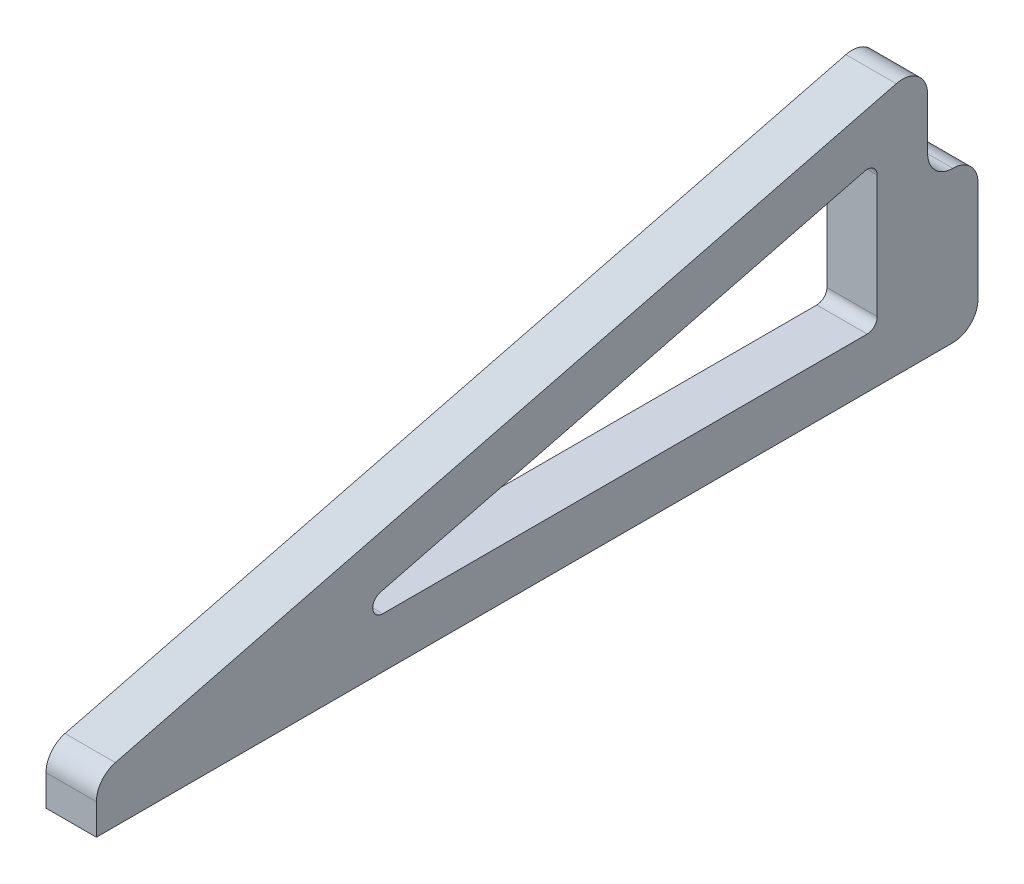
ISO-10303-21;
HEADER;
FILE_DESCRIPTION(('STEP AP214'),'2;1');
FILE_NAME('part.step','',(''),(''),'','','');
FILE_SCHEMA(('AUTOMOTIVE_DESIGN { 1 0 10303 214 1 1 1 1 }'));
ENDSEC;
DATA;
#1=APPLICATION_CONTEXT('core data for automotive mechanical design processes');
#2=APPLICATION_PROTOCOL_DEFINITION('international standard','automotive_design',2000,#1);
#3=PRODUCT_CONTEXT('',#1,'mechanical');
#4=PRODUCT('Part','Part','',(#3));
#5=PRODUCT_RELATED_PRODUCT_CATEGORY('part','',(#4));
#6=PRODUCT_DEFINITION_FORMATION('','',#4);
#7=PRODUCT_DEFINITION_CONTEXT('part definition',#1,'design');
#8=PRODUCT_DEFINITION('design','',#6,#7);
#9=PRODUCT_DEFINITION_SHAPE('','',#8);
#10=(LENGTH_UNIT() NAMED_UNIT(*) SI_UNIT(.MILLI.,.METRE.));
#11=(NAMED_UNIT(*) PLANE_ANGLE_UNIT() SI_UNIT($,.RADIAN.));
#12=(NAMED_UNIT(*) SI_UNIT($,.STERADIAN.) SOLID_ANGLE_UNIT());
#13=UNCERTAINTY_MEASURE_WITH_UNIT(LENGTH_MEASURE(1.E-05),#10,'distance_accuracy_value','');
#14=(GEOMETRIC_REPRESENTATION_CONTEXT(3) GLOBAL_UNCERTAINTY_ASSIGNED_CONTEXT((#13)) GLOBAL_UNIT_ASSIGNED_CONTEXT((#10,
#11,#12)) REPRESENTATION_CONTEXT('',''));
#15=CARTESIAN_POINT('',(0.,0.,0.));
#16=DIRECTION('',(0.,0.,1.));
#17=DIRECTION('',(1.,0.,0.));
#18=AXIS2_PLACEMENT_3D('',#15,#16,#17);
#19=CARTESIAN_POINT('',(12.7,-156.793460948185,-10.8700336615597));
#20=DIRECTION('',(1.,0.,0.));
#21=DIRECTION('',(0.,0.,-1.));
#22=AXIS2_PLACEMENT_3D('',#19,#20,#21);
#23=PLANE('',#22);
#24=DIRECTION('',(0.,0.,-1.));
#25=VECTOR('',#24,1.);
#26=CARTESIAN_POINT('',(12.7,-58.2070633333334,176.79917862854));
#27=LINE('',#26,#25);
#28=CARTESIAN_POINT('',(12.7,-58.2070633333334,156.395040848194));
#29=VERTEX_POINT('',#28);
#30=CARTESIAN_POINT('',(12.7,-58.2070633333334,34.29));
#31=VERTEX_POINT('',#30);
#32=EDGE_CURVE('E40',#29,#31,#27,.T.);
#33=ORIENTED_EDGE('',*,*,#32,.T.);
#34=CARTESIAN_POINT('',(12.7,-55.6670633333334,34.29));
#35=DIRECTION('',(1.,0.,0.));
#36=DIRECTION('',(0.,0.,-1.));
#37=AXIS2_PLACEMENT_3D('',#34,#35,#36);
#38=CIRCLE('',#37,2.54);
#39=CARTESIAN_POINT('',(12.7,-55.6670633333334,31.75));
#40=VERTEX_POINT('',#39);
#41=EDGE_CURVE('E247',#40,#31,#38,.F.);
#42=ORIENTED_EDGE('',*,*,#41,.F.);
#43=DIRECTION('',(0.,1.,0.));
#44=VECTOR('',#43,1.);
#45=CARTESIAN_POINT('',(12.7,-21.5258720205113,31.75));
#46=LINE('',#45,#44);
#47=CARTESIAN_POINT('',(12.7,-24.7881682857246,31.75));
#48=VERTEX_POINT('',#47);
#49=EDGE_CURVE('E252',#40,#48,#46,.T.);
#50=ORIENTED_EDGE('',*,*,#49,.T.);
#51=CARTESIAN_POINT('',(12.7,-24.7881682857246,34.29));
#52=DIRECTION('',(1.,0.,0.));
#53=DIRECTION('',(0.,0.,-1.));
#54=AXIS2_PLACEMENT_3D('',#51,#52,#53);
#55=CIRCLE('',#54,2.54);
#56=CARTESIAN_POINT('',(12.7,-22.3256887313528,34.912731438343));
#57=VERTEX_POINT('',#56);
#58=EDGE_CURVE('E241',#57,#48,#55,.F.);
#59=ORIENTED_EDGE('',*,*,#58,.F.);
#60=DIRECTION('',(0.,-0.245169857615365,0.969480139516464));
#61=VECTOR('',#60,1.);
#62=CARTESIAN_POINT('',(12.7,-50.792110364231,147.478079742594));
#63=LINE('',#62,#61);
#64=CARTESIAN_POINT('',(12.7,-53.2045837789615,157.017772286537));
#65=VERTEX_POINT('',#64);
#66=EDGE_CURVE('E249',#57,#65,#63,.T.);
#67=ORIENTED_EDGE('',*,*,#66,.T.);
#68=CARTESIAN_POINT('',(12.7,-55.6670633333334,156.395040848194));
#69=DIRECTION('',(1.,0.,0.));
#70=DIRECTION('',(0.,0.,-1.));
#71=AXIS2_PLACEMENT_3D('',#68,#69,#70);
#72=CIRCLE('',#71,2.54);
#73=EDGE_CURVE('E254',#29,#65,#72,.F.);
#74=ORIENTED_EDGE('',*,*,#73,.F.);
#75=EDGE_LOOP('',(#33,#42,#50,#59,#67,#74));
#76=FACE_BOUND('',#75,.T.);
#77=DIRECTION('',(0.,-0.245169857615367,0.969480139516463));
#78=VECTOR('',#77,1.);
#79=CARTESIAN_POINT('',(12.7,-0.373019534676384,-0.094332150269703));
#80=LINE('',#79,#78);
#81=CARTESIAN_POINT('',(12.7,-7.21393247154818,26.9568285958576));
#82=VERTEX_POINT('',#81);
#83=CARTESIAN_POINT('',(12.7,-56.9949279808075,223.806828595858));
#84=VERTEX_POINT('',#83);
#85=EDGE_CURVE('E283',#82,#84,#80,.T.);
#86=ORIENTED_EDGE('',*,*,#85,.F.);
#87=CARTESIAN_POINT('',(12.7,-13.3701313574777,25.4));
#88=DIRECTION('',(-1.,0.,0.));
#89=DIRECTION('',(0.,0.,1.));
#90=AXIS2_PLACEMENT_3D('',#87,#88,#89);
#91=CIRCLE('',#90,6.35);
#92=CARTESIAN_POINT('',(12.7,-13.3701313574777,19.05));
#93=VERTEX_POINT('',#92);
#94=EDGE_CURVE('E45',#82,#93,#91,.T.);
#95=ORIENTED_EDGE('',*,*,#94,.T.);
#96=DIRECTION('',(0.,-1.,0.));
#97=VECTOR('',#96,1.);
#98=CARTESIAN_POINT('',(12.7,0.,19.05));
#99=LINE('',#98,#97);
#100=CARTESIAN_POINT('',(12.7,-26.4570633333333,19.05));
#101=VERTEX_POINT('',#100);
#102=EDGE_CURVE('E11',#93,#101,#99,.T.);
#103=ORIENTED_EDGE('',*,*,#102,.T.);
#104=CARTESIAN_POINT('',(12.7,-26.4570633333333,12.7));
#105=DIRECTION('',(-1.,0.,0.));
#106=DIRECTION('',(0.,0.,1.));
#107=AXIS2_PLACEMENT_3D('',#104,#105,#106);
#108=CIRCLE('',#107,6.35);
#109=CARTESIAN_POINT('',(12.7,-32.8070633333333,12.7));
#110=VERTEX_POINT('',#109);
#111=EDGE_CURVE('E205',#101,#110,#108,.F.);
#112=ORIENTED_EDGE('',*,*,#111,.T.);
#113=CARTESIAN_POINT('',(12.7,-39.1570633333333,12.7));
#114=DIRECTION('',(-1.,0.,0.));
#115=DIRECTION('',(0.,0.,1.));
#116=AXIS2_PLACEMENT_3D('',#113,#114,#115);
#117=CIRCLE('',#116,6.35);
#118=CARTESIAN_POINT('',(12.7,-39.1570633333333,6.35000000000001));
#119=VERTEX_POINT('',#118);
#120=EDGE_CURVE('E236',#110,#119,#117,.T.);
#121=ORIENTED_EDGE('',*,*,#120,.T.);
#122=DIRECTION('',(0.,1.,0.));
#123=VECTOR('',#122,1.);
#124=CARTESIAN_POINT('',(12.7,-70.9070633333333,6.35000000000001));
#125=LINE('',#124,#123);
#126=CARTESIAN_POINT('',(12.7,-64.5570633333333,6.35000000000001));
#127=VERTEX_POINT('',#126);
#128=EDGE_CURVE('E245',#127,#119,#125,.T.);
#129=ORIENTED_EDGE('',*,*,#128,.F.);
#130=CARTESIAN_POINT('',(12.7,-64.5570633333333,12.7));
#131=DIRECTION('',(-1.,0.,0.));
#132=DIRECTION('',(0.,0.,1.));
#133=AXIS2_PLACEMENT_3D('',#130,#131,#132);
#134=CIRCLE('',#133,6.35);
#135=CARTESIAN_POINT('',(12.7,-70.9070633333333,12.7));
#136=VERTEX_POINT('',#135);
#137=EDGE_CURVE('E197',#127,#136,#134,.T.);
#138=ORIENTED_EDGE('',*,*,#137,.T.);
#139=DIRECTION('',(0.,0.,-1.));
#140=VECTOR('',#139,1.);
#141=CARTESIAN_POINT('',(12.7,-70.9070633333333,0.));
#142=LINE('',#141,#140);
#143=CARTESIAN_POINT('',(12.7,-70.9070633333334,228.6));
#144=VERTEX_POINT('',#143);
#145=EDGE_CURVE('E59',#144,#136,#142,.T.);
#146=ORIENTED_EDGE('',*,*,#145,.F.);
#147=DIRECTION('',(0.,-1.,0.));
#148=VECTOR('',#147,1.);
#149=CARTESIAN_POINT('',(12.7,-70.9070633333334,228.6));
#150=LINE('',#149,#148);
#151=CARTESIAN_POINT('',(12.7,-63.151126866737,228.6));
#152=VERTEX_POINT('',#151);
#153=EDGE_CURVE('E169',#152,#144,#150,.T.);
#154=ORIENTED_EDGE('',*,*,#153,.F.);
#155=CARTESIAN_POINT('',(12.7,-63.151126866737,222.25));
#156=DIRECTION('',(1.,0.,0.));
#157=DIRECTION('',(0.,0.,-1.));
#158=AXIS2_PLACEMENT_3D('',#155,#156,#157);
#159=CIRCLE('',#158,6.35);
#160=EDGE_CURVE('E239',#152,#84,#159,.F.);
#161=ORIENTED_EDGE('',*,*,#160,.T.);
#162=EDGE_LOOP('',(#86,#95,#103,#112,#121,#129,#138,#146,#154,#161));
#163=FACE_BOUND('',#162,.T.);
#164=ADVANCED_FACE('F37',(#76,#163),#23,.F.);
#165=CARTESIAN_POINT('',(25.4,-70.9070633333333,0.));
#166=DIRECTION('',(0.,1.,0.));
#167=DIRECTION('',(0.,0.,1.));
#168=AXIS2_PLACEMENT_3D('',#165,#166,#167);
#169=PLANE('',#168);
#170=DIRECTION('',(-1.,0.,0.));
#171=VECTOR('',#170,1.);
#172=CARTESIAN_POINT('',(25.4,-70.9070633333334,228.6));
#173=LINE('',#172,#171);
#174=CARTESIAN_POINT('',(25.4,-70.9070633333334,228.6));
#175=VERTEX_POINT('',#174);
#176=EDGE_CURVE('E153',#175,#144,#173,.T.);
#177=ORIENTED_EDGE('',*,*,#176,.T.);
#178=ORIENTED_EDGE('',*,*,#145,.T.);
#179=DIRECTION('',(-1.,0.,0.));
#180=VECTOR('',#179,1.);
#181=CARTESIAN_POINT('',(25.4,-70.9070633333333,12.7));
#182=LINE('',#181,#180);
#183=CARTESIAN_POINT('',(25.4,-70.9070633333333,12.7));
#184=VERTEX_POINT('',#183);
#185=EDGE_CURVE('E155',#136,#184,#182,.F.);
#186=ORIENTED_EDGE('',*,*,#185,.T.);
#187=DIRECTION('',(0.,0.,-1.));
#188=VECTOR('',#187,1.);
#189=CARTESIAN_POINT('',(25.4,-70.9070633333334,114.3));
#190=LINE('',#189,#188);
#191=EDGE_CURVE('E150',#175,#184,#190,.T.);
#192=ORIENTED_EDGE('',*,*,#191,.F.);
#193=EDGE_LOOP('',(#177,#178,#186,#192));
#194=FACE_BOUND('',#193,.T.);
#195=ADVANCED_FACE('F152',(#194),#169,.F.);
#196=CARTESIAN_POINT('',(12.7,0.,19.05));
#197=DIRECTION('',(0.,0.,1.));
#198=DIRECTION('',(0.,-1.,0.));
#199=AXIS2_PLACEMENT_3D('',#196,#197,#198);
#200=PLANE('',#199);
#201=DIRECTION('',(0.,-1.,0.));
#202=VECTOR('',#201,1.);
#203=CARTESIAN_POINT('',(25.4,0.,19.05));
#204=LINE('',#203,#202);
#205=CARTESIAN_POINT('',(25.4,-13.3701313574777,19.05));
#206=VERTEX_POINT('',#205);
#207=CARTESIAN_POINT('',(25.4,-26.4570633333333,19.05));
#208=VERTEX_POINT('',#207);
#209=EDGE_CURVE('E171',#206,#208,#204,.T.);
#210=ORIENTED_EDGE('',*,*,#209,.T.);
#211=DIRECTION('',(-1.,0.,0.));
#212=VECTOR('',#211,1.);
#213=CARTESIAN_POINT('',(12.7,-26.4570633333333,19.05));
#214=LINE('',#213,#212);
#215=EDGE_CURVE('E231',#208,#101,#214,.T.);
#216=ORIENTED_EDGE('',*,*,#215,.T.);
#217=ORIENTED_EDGE('',*,*,#102,.F.);
#218=DIRECTION('',(1.,0.,0.));
#219=VECTOR('',#218,1.);
#220=CARTESIAN_POINT('',(12.7,-13.3701313574777,19.05));
#221=LINE('',#220,#219);
#222=EDGE_CURVE('E188',#93,#206,#221,.T.);
#223=ORIENTED_EDGE('',*,*,#222,.T.);
#224=EDGE_LOOP('',(#210,#216,#217,#223));
#225=FACE_BOUND('',#224,.T.);
#226=ADVANCED_FACE('F304',(#225),#200,.F.);
#227=CARTESIAN_POINT('',(12.7,-26.4570633333333,12.7));
#228=DIRECTION('',(1.,0.,0.));
#229=DIRECTION('',(0.,0.,-1.));
#230=AXIS2_PLACEMENT_3D('',#227,#228,#229);
#231=CYLINDRICAL_SURFACE('',#230,6.35);
#232=ORIENTED_EDGE('',*,*,#215,.F.);
#233=CARTESIAN_POINT('',(25.4,-26.4570633333333,12.7));
#234=DIRECTION('',(-1.,0.,0.));
#235=DIRECTION('',(0.,0.,1.));
#236=AXIS2_PLACEMENT_3D('',#233,#234,#235);
#237=CIRCLE('',#236,6.35);
#238=CARTESIAN_POINT('',(25.4,-32.8070633333333,12.7));
#239=VERTEX_POINT('',#238);
#240=EDGE_CURVE('E233',#239,#208,#237,.T.);
#241=ORIENTED_EDGE('',*,*,#240,.F.);
#242=DIRECTION('',(-1.,0.,0.));
#243=VECTOR('',#242,1.);
#244=CARTESIAN_POINT('',(25.4,-32.8070633333333,12.7));
#245=LINE('',#244,#243);
#246=EDGE_CURVE('E242',#110,#239,#245,.F.);
#247=ORIENTED_EDGE('',*,*,#246,.F.);
#248=ORIENTED_EDGE('',*,*,#111,.F.);
#249=EDGE_LOOP('',(#232,#241,#247,#248));
#250=FACE_BOUND('',#249,.T.);
#251=ADVANCED_FACE('F303',(#250),#231,.F.);
#252=CARTESIAN_POINT('',(65.5609262841384,-70.9070633333333,6.35000000000001));
#253=DIRECTION('',(0.,0.,1.));
#254=DIRECTION('',(1.,0.,0.));
#255=AXIS2_PLACEMENT_3D('',#252,#253,#254);
#256=PLANE('',#255);
#257=ORIENTED_EDGE('',*,*,#128,.T.);
#258=DIRECTION('',(-1.,0.,0.));
#259=VECTOR('',#258,1.);
#260=CARTESIAN_POINT('',(65.5609262841384,-39.1570633333333,6.35000000000001));
#261=LINE('',#260,#259);
#262=CARTESIAN_POINT('',(25.4,-39.1570633333333,6.35000000000001));
#263=VERTEX_POINT('',#262);
#264=EDGE_CURVE('E226',#119,#263,#261,.F.);
#265=ORIENTED_EDGE('',*,*,#264,.T.);
#266=DIRECTION('',(0.,-1.,0.));
#267=VECTOR('',#266,1.);
#268=CARTESIAN_POINT('',(25.4,-70.9070633333333,6.35000000000001));
#269=LINE('',#268,#267);
#270=CARTESIAN_POINT('',(25.4,-64.5570633333333,6.35000000000001));
#271=VERTEX_POINT('',#270);
#272=EDGE_CURVE('E286',#263,#271,#269,.T.);
#273=ORIENTED_EDGE('',*,*,#272,.T.);
#274=DIRECTION('',(-1.,0.,0.));
#275=VECTOR('',#274,1.);
#276=CARTESIAN_POINT('',(65.5609262841384,-64.5570633333333,6.35000000000001));
#277=LINE('',#276,#275);
#278=EDGE_CURVE('E195',#271,#127,#277,.T.);
#279=ORIENTED_EDGE('',*,*,#278,.T.);
#280=EDGE_LOOP('',(#257,#265,#273,#279));
#281=FACE_BOUND('',#280,.T.);
#282=ADVANCED_FACE('F289',(#281),#256,.F.);
#283=CARTESIAN_POINT('',(25.4,0.,0.));
#284=DIRECTION('',(-1.,0.,0.));
#285=DIRECTION('',(0.,0.,1.));
#286=AXIS2_PLACEMENT_3D('',#283,#284,#285);
#287=PLANE('',#286);
#288=DIRECTION('',(0.,-0.245169857615365,0.969480139516464));
#289=VECTOR('',#288,1.);
#290=CARTESIAN_POINT('',(25.4,-50.792110364231,147.478079742594));
#291=LINE('',#290,#289);
#292=CARTESIAN_POINT('',(25.4,-22.3256887313528,34.912731438343));
#293=VERTEX_POINT('',#292);
#294=CARTESIAN_POINT('',(25.4,-53.2045837789615,157.017772286537));
#295=VERTEX_POINT('',#294);
#296=EDGE_CURVE('E170',#293,#295,#291,.T.);
#297=ORIENTED_EDGE('',*,*,#296,.F.);
#298=CARTESIAN_POINT('',(25.4,-24.7881682857246,34.29));
#299=DIRECTION('',(-1.,0.,0.));
#300=DIRECTION('',(0.,0.,1.));
#301=AXIS2_PLACEMENT_3D('',#298,#299,#300);
#302=CIRCLE('',#301,2.54);
#303=CARTESIAN_POINT('',(25.4,-24.7881682857246,31.75));
#304=VERTEX_POINT('',#303);
#305=EDGE_CURVE('E224',#293,#304,#302,.T.);
#306=ORIENTED_EDGE('',*,*,#305,.T.);
#307=DIRECTION('',(0.,1.,0.));
#308=VECTOR('',#307,1.);
#309=CARTESIAN_POINT('',(25.4,-21.5258720205113,31.75));
#310=LINE('',#309,#308);
#311=CARTESIAN_POINT('',(25.4,-55.6670633333334,31.75));
#312=VERTEX_POINT('',#311);
#313=EDGE_CURVE('E180',#312,#304,#310,.T.);
#314=ORIENTED_EDGE('',*,*,#313,.F.);
#315=CARTESIAN_POINT('',(25.4,-55.6670633333334,34.29));
#316=DIRECTION('',(-1.,0.,0.));
#317=DIRECTION('',(0.,0.,1.));
#318=AXIS2_PLACEMENT_3D('',#315,#316,#317);
#319=CIRCLE('',#318,2.54);
#320=CARTESIAN_POINT('',(25.4,-58.2070633333334,34.29));
#321=VERTEX_POINT('',#320);
#322=EDGE_CURVE('E220',#312,#321,#319,.T.);
#323=ORIENTED_EDGE('',*,*,#322,.T.);
#324=DIRECTION('',(0.,0.,-1.));
#325=VECTOR('',#324,1.);
#326=CARTESIAN_POINT('',(25.4,-58.2070633333334,176.79917862854));
#327=LINE('',#326,#325);
#328=CARTESIAN_POINT('',(25.4,-58.2070633333334,156.395040848194));
#329=VERTEX_POINT('',#328);
#330=EDGE_CURVE('E274',#329,#321,#327,.T.);
#331=ORIENTED_EDGE('',*,*,#330,.F.);
#332=CARTESIAN_POINT('',(25.4,-55.6670633333334,156.395040848194));
#333=DIRECTION('',(-1.,0.,0.));
#334=DIRECTION('',(0.,0.,1.));
#335=AXIS2_PLACEMENT_3D('',#332,#333,#334);
#336=CIRCLE('',#335,2.54);
#337=EDGE_CURVE('E222',#329,#295,#336,.T.);
#338=ORIENTED_EDGE('',*,*,#337,.T.);
#339=EDGE_LOOP('',(#297,#306,#314,#323,#331,#338));
#340=FACE_BOUND('',#339,.T.);
#341=ORIENTED_EDGE('',*,*,#272,.F.);
#342=CARTESIAN_POINT('',(25.4,-39.1570633333333,12.7));
#343=DIRECTION('',(-1.,0.,0.));
#344=DIRECTION('',(0.,0.,1.));
#345=AXIS2_PLACEMENT_3D('',#342,#343,#344);
#346=CIRCLE('',#345,6.35);
#347=EDGE_CURVE('E229',#263,#239,#346,.F.);
#348=ORIENTED_EDGE('',*,*,#347,.T.);
#349=ORIENTED_EDGE('',*,*,#240,.T.);
#350=ORIENTED_EDGE('',*,*,#209,.F.);
#351=CARTESIAN_POINT('',(25.4,-13.3701313574777,25.4));
#352=DIRECTION('',(-1.,0.,0.));
#353=DIRECTION('',(0.,0.,1.));
#354=AXIS2_PLACEMENT_3D('',#351,#352,#353);
#355=CIRCLE('',#354,6.35);
#356=CARTESIAN_POINT('',(25.4,-7.21393247154818,26.9568285958576));
#357=VERTEX_POINT('',#356);
#358=EDGE_CURVE('E190',#206,#357,#355,.F.);
#359=ORIENTED_EDGE('',*,*,#358,.T.);
#360=DIRECTION('',(0.,-0.245169857615368,0.969480139516463));
#361=VECTOR('',#360,1.);
#362=CARTESIAN_POINT('',(25.4,-58.2070633333334,228.6));
#363=LINE('',#362,#361);
#364=CARTESIAN_POINT('',(25.4,-56.9949279808075,223.806828595858));
#365=VERTEX_POINT('',#364);
#366=EDGE_CURVE('E178',#357,#365,#363,.T.);
#367=ORIENTED_EDGE('',*,*,#366,.T.);
#368=CARTESIAN_POINT('',(25.4,-63.151126866737,222.25));
#369=DIRECTION('',(-1.,0.,0.));
#370=DIRECTION('',(0.,0.,1.));
#371=AXIS2_PLACEMENT_3D('',#368,#369,#370);
#372=CIRCLE('',#371,6.35);
#373=CARTESIAN_POINT('',(25.4,-63.151126866737,228.6));
#374=VERTEX_POINT('',#373);
#375=EDGE_CURVE('E177',#365,#374,#372,.F.);
#376=ORIENTED_EDGE('',*,*,#375,.T.);
#377=DIRECTION('',(0.,-1.,0.));
#378=VECTOR('',#377,1.);
#379=CARTESIAN_POINT('',(25.4,-70.9070633333334,228.6));
#380=LINE('',#379,#378);
#381=EDGE_CURVE('E161',#374,#175,#380,.T.);
#382=ORIENTED_EDGE('',*,*,#381,.T.);
#383=ORIENTED_EDGE('',*,*,#191,.T.);
#384=CARTESIAN_POINT('',(25.4,-64.5570633333333,12.7));
#385=DIRECTION('',(-1.,0.,0.));
#386=DIRECTION('',(0.,0.,1.));
#387=AXIS2_PLACEMENT_3D('',#384,#385,#386);
#388=CIRCLE('',#387,6.35);
#389=EDGE_CURVE('E201',#184,#271,#388,.F.);
#390=ORIENTED_EDGE('',*,*,#389,.T.);
#391=EDGE_LOOP('',(#341,#348,#349,#350,#359,#367,#376,#382,#383,#390));
#392=FACE_BOUND('',#391,.T.);
#393=ADVANCED_FACE('F174',(#340,#392),#287,.F.);
#394=CARTESIAN_POINT('',(65.5609262841384,-39.1570633333333,12.7));
#395=DIRECTION('',(-1.,0.,0.));
#396=DIRECTION('',(0.,0.,1.));
#397=AXIS2_PLACEMENT_3D('',#394,#395,#396);
#398=CYLINDRICAL_SURFACE('',#397,6.35);
#399=ORIENTED_EDGE('',*,*,#347,.F.);
#400=ORIENTED_EDGE('',*,*,#264,.F.);
#401=ORIENTED_EDGE('',*,*,#120,.F.);
#402=ORIENTED_EDGE('',*,*,#246,.T.);
#403=EDGE_LOOP('',(#399,#400,#401,#402));
#404=FACE_BOUND('',#403,.T.);
#405=ADVANCED_FACE('F298',(#404),#398,.T.);
#406=CARTESIAN_POINT('',(25.4,-21.5258720205113,31.75));
#407=DIRECTION('',(0.,0.,1.));
#408=DIRECTION('',(1.,0.,0.));
#409=AXIS2_PLACEMENT_3D('',#406,#407,#408);
#410=PLANE('',#409);
#411=ORIENTED_EDGE('',*,*,#49,.F.);
#412=DIRECTION('',(-1.,0.,0.));
#413=VECTOR('',#412,1.);
#414=CARTESIAN_POINT('',(25.4,-55.6670633333334,31.75));
#415=LINE('',#414,#413);
#416=EDGE_CURVE('E213',#40,#312,#415,.F.);
#417=ORIENTED_EDGE('',*,*,#416,.T.);
#418=ORIENTED_EDGE('',*,*,#313,.T.);
#419=DIRECTION('',(-1.,0.,0.));
#420=VECTOR('',#419,1.);
#421=CARTESIAN_POINT('',(0.,-24.7881682857246,31.75));
#422=LINE('',#421,#420);
#423=EDGE_CURVE('E210',#304,#48,#422,.T.);
#424=ORIENTED_EDGE('',*,*,#423,.T.);
#425=EDGE_LOOP('',(#411,#417,#418,#424));
#426=FACE_BOUND('',#425,.T.);
#427=ADVANCED_FACE('F355',(#426),#410,.T.);
#428=CARTESIAN_POINT('',(25.4,-50.792110364231,147.478079742594));
#429=DIRECTION('',(0.,-0.969480139516464,-0.245169857615365));
#430=DIRECTION('',(0.,0.245169857615365,-0.969480139516464));
#431=AXIS2_PLACEMENT_3D('',#428,#429,#430);
#432=PLANE('',#431);
#433=ORIENTED_EDGE('',*,*,#66,.F.);
#434=DIRECTION('',(-1.,0.,0.));
#435=VECTOR('',#434,1.);
#436=CARTESIAN_POINT('',(25.4,-22.3256887313528,34.912731438343));
#437=LINE('',#436,#435);
#438=EDGE_CURVE('E215',#57,#293,#437,.F.);
#439=ORIENTED_EDGE('',*,*,#438,.T.);
#440=ORIENTED_EDGE('',*,*,#296,.T.);
#441=DIRECTION('',(-1.,0.,0.));
#442=VECTOR('',#441,1.);
#443=CARTESIAN_POINT('',(0.,-53.2045837789615,157.017772286537));
#444=LINE('',#443,#442);
#445=EDGE_CURVE('E217',#295,#65,#444,.T.);
#446=ORIENTED_EDGE('',*,*,#445,.T.);
#447=EDGE_LOOP('',(#433,#439,#440,#446));
#448=FACE_BOUND('',#447,.T.);
#449=ADVANCED_FACE('F352',(#448),#432,.T.);
#450=CARTESIAN_POINT('',(25.4,-24.7881682857246,34.29));
#451=DIRECTION('',(1.,0.,0.));
#452=DIRECTION('',(0.,0.,-1.));
#453=AXIS2_PLACEMENT_3D('',#450,#451,#452);
#454=CYLINDRICAL_SURFACE('',#453,2.54);
#455=ORIENTED_EDGE('',*,*,#438,.F.);
#456=ORIENTED_EDGE('',*,*,#58,.T.);
#457=ORIENTED_EDGE('',*,*,#423,.F.);
#458=ORIENTED_EDGE('',*,*,#305,.F.);
#459=EDGE_LOOP('',(#455,#456,#457,#458));
#460=FACE_BOUND('',#459,.T.);
#461=ADVANCED_FACE('F349',(#460),#454,.F.);
#462=CARTESIAN_POINT('',(25.4,-58.2070633333334,176.79917862854));
#463=DIRECTION('',(0.,1.,0.));
#464=DIRECTION('',(0.,0.,1.));
#465=AXIS2_PLACEMENT_3D('',#462,#463,#464);
#466=PLANE('',#465);
#467=ORIENTED_EDGE('',*,*,#32,.F.);
#468=DIRECTION('',(-1.,0.,0.));
#469=VECTOR('',#468,1.);
#470=CARTESIAN_POINT('',(25.4,-58.2070633333334,156.395040848194));
#471=LINE('',#470,#469);
#472=EDGE_CURVE('E203',#29,#329,#471,.F.);
#473=ORIENTED_EDGE('',*,*,#472,.T.);
#474=ORIENTED_EDGE('',*,*,#330,.T.);
#475=DIRECTION('',(-1.,0.,0.));
#476=VECTOR('',#475,1.);
#477=CARTESIAN_POINT('',(0.,-58.2070633333334,34.29));
#478=LINE('',#477,#476);
#479=EDGE_CURVE('E207',#321,#31,#478,.T.);
#480=ORIENTED_EDGE('',*,*,#479,.T.);
#481=EDGE_LOOP('',(#467,#473,#474,#480));
#482=FACE_BOUND('',#481,.T.);
#483=ADVANCED_FACE('F272',(#482),#466,.T.);
#484=CARTESIAN_POINT('',(25.4,-55.6670633333334,156.395040848194));
#485=DIRECTION('',(1.,0.,0.));
#486=DIRECTION('',(0.,0.,-1.));
#487=AXIS2_PLACEMENT_3D('',#484,#485,#486);
#488=CYLINDRICAL_SURFACE('',#487,2.54);
#489=ORIENTED_EDGE('',*,*,#472,.F.);
#490=ORIENTED_EDGE('',*,*,#73,.T.);
#491=ORIENTED_EDGE('',*,*,#445,.F.);
#492=ORIENTED_EDGE('',*,*,#337,.F.);
#493=EDGE_LOOP('',(#489,#490,#491,#492));
#494=FACE_BOUND('',#493,.T.);
#495=ADVANCED_FACE('F343',(#494),#488,.F.);
#496=CARTESIAN_POINT('',(25.4,-55.6670633333334,34.29));
#497=DIRECTION('',(1.,0.,0.));
#498=DIRECTION('',(0.,0.,-1.));
#499=AXIS2_PLACEMENT_3D('',#496,#497,#498);
#500=CYLINDRICAL_SURFACE('',#499,2.54);
#501=ORIENTED_EDGE('',*,*,#416,.F.);
#502=ORIENTED_EDGE('',*,*,#41,.T.);
#503=ORIENTED_EDGE('',*,*,#479,.F.);
#504=ORIENTED_EDGE('',*,*,#322,.F.);
#505=EDGE_LOOP('',(#501,#502,#503,#504));
#506=FACE_BOUND('',#505,.T.);
#507=ADVANCED_FACE('F264',(#506),#500,.F.);
#508=CARTESIAN_POINT('',(65.5609262841384,-64.5570633333333,12.7));
#509=DIRECTION('',(-1.,0.,0.));
#510=DIRECTION('',(0.,0.,1.));
#511=AXIS2_PLACEMENT_3D('',#508,#509,#510);
#512=CYLINDRICAL_SURFACE('',#511,6.35);
#513=ORIENTED_EDGE('',*,*,#389,.F.);
#514=ORIENTED_EDGE('',*,*,#185,.F.);
#515=ORIENTED_EDGE('',*,*,#137,.F.);
#516=ORIENTED_EDGE('',*,*,#278,.F.);
#517=EDGE_LOOP('',(#513,#514,#515,#516));
#518=FACE_BOUND('',#517,.T.);
#519=ADVANCED_FACE('F293',(#518),#512,.T.);
#520=CARTESIAN_POINT('',(25.4,-58.2070633333334,228.6));
#521=DIRECTION('',(0.,-0.969480139516463,-0.245169857615368));
#522=DIRECTION('',(0.,0.245169857615368,-0.969480139516463));
#523=AXIS2_PLACEMENT_3D('',#520,#521,#522);
#524=PLANE('',#523);
#525=ORIENTED_EDGE('',*,*,#85,.T.);
#526=DIRECTION('',(-1.,0.,0.));
#527=VECTOR('',#526,1.);
#528=CARTESIAN_POINT('',(25.4,-56.9949279808075,223.806828595858));
#529=LINE('',#528,#527);
#530=EDGE_CURVE('E185',#84,#365,#529,.F.);
#531=ORIENTED_EDGE('',*,*,#530,.T.);
#532=ORIENTED_EDGE('',*,*,#366,.F.);
#533=DIRECTION('',(1.,0.,0.));
#534=VECTOR('',#533,1.);
#535=CARTESIAN_POINT('',(25.4,-7.21393247154818,26.9568285958576));
#536=LINE('',#535,#534);
#537=EDGE_CURVE('E192',#357,#82,#536,.F.);
#538=ORIENTED_EDGE('',*,*,#537,.T.);
#539=EDGE_LOOP('',(#525,#531,#532,#538));
#540=FACE_BOUND('',#539,.T.);
#541=ADVANCED_FACE('F310',(#540),#524,.F.);
#542=CARTESIAN_POINT('',(12.7,-13.3701313574777,25.4));
#543=DIRECTION('',(1.,0.,0.));
#544=DIRECTION('',(0.,0.,-1.));
#545=AXIS2_PLACEMENT_3D('',#542,#543,#544);
#546=CYLINDRICAL_SURFACE('',#545,6.35);
#547=ORIENTED_EDGE('',*,*,#94,.F.);
#548=ORIENTED_EDGE('',*,*,#537,.F.);
#549=ORIENTED_EDGE('',*,*,#358,.F.);
#550=ORIENTED_EDGE('',*,*,#222,.F.);
#551=EDGE_LOOP('',(#547,#548,#549,#550));
#552=FACE_BOUND('',#551,.T.);
#553=ADVANCED_FACE('F312',(#552),#546,.T.);
#554=CARTESIAN_POINT('',(25.4,-70.9070633333334,228.6));
#555=DIRECTION('',(0.,0.,-1.));
#556=DIRECTION('',(-1.,0.,0.));
#557=AXIS2_PLACEMENT_3D('',#554,#555,#556);
#558=PLANE('',#557);
#559=DIRECTION('',(-1.,0.,0.));
#560=VECTOR('',#559,1.);
#561=CARTESIAN_POINT('',(25.4,-63.151126866737,228.6));
#562=LINE('',#561,#560);
#563=EDGE_CURVE('E160',#374,#152,#562,.T.);
#564=ORIENTED_EDGE('',*,*,#563,.T.);
#565=ORIENTED_EDGE('',*,*,#153,.T.);
#566=ORIENTED_EDGE('',*,*,#176,.F.);
#567=ORIENTED_EDGE('',*,*,#381,.F.);
#568=EDGE_LOOP('',(#564,#565,#566,#567));
#569=FACE_BOUND('',#568,.T.);
#570=ADVANCED_FACE('F166',(#569),#558,.F.);
#571=CARTESIAN_POINT('',(25.4,-63.151126866737,222.25));
#572=DIRECTION('',(-1.,0.,0.));
#573=DIRECTION('',(0.,0.,1.));
#574=AXIS2_PLACEMENT_3D('',#571,#572,#573);
#575=CYLINDRICAL_SURFACE('',#574,6.35);
#576=ORIENTED_EDGE('',*,*,#160,.F.);
#577=ORIENTED_EDGE('',*,*,#563,.F.);
#578=ORIENTED_EDGE('',*,*,#375,.F.);
#579=ORIENTED_EDGE('',*,*,#530,.F.);
#580=EDGE_LOOP('',(#576,#577,#578,#579));
#581=FACE_BOUND('',#580,.T.);
#582=ADVANCED_FACE('F314',(#581),#575,.T.);
#583=CLOSED_SHELL('',(#164,#195,#226,#251,#282,#393,#405,#427,#449,#461,#483,#495,#507,#519,
#541,#553,#570,#582));
#584=MANIFOLD_SOLID_BREP('B2',#583);
#585=ADVANCED_BREP_SHAPE_REPRESENTATION('',(#18,#584),#14);
#586=SHAPE_DEFINITION_REPRESENTATION(#9,#585);
ENDSEC;
END-ISO-10303-21;
